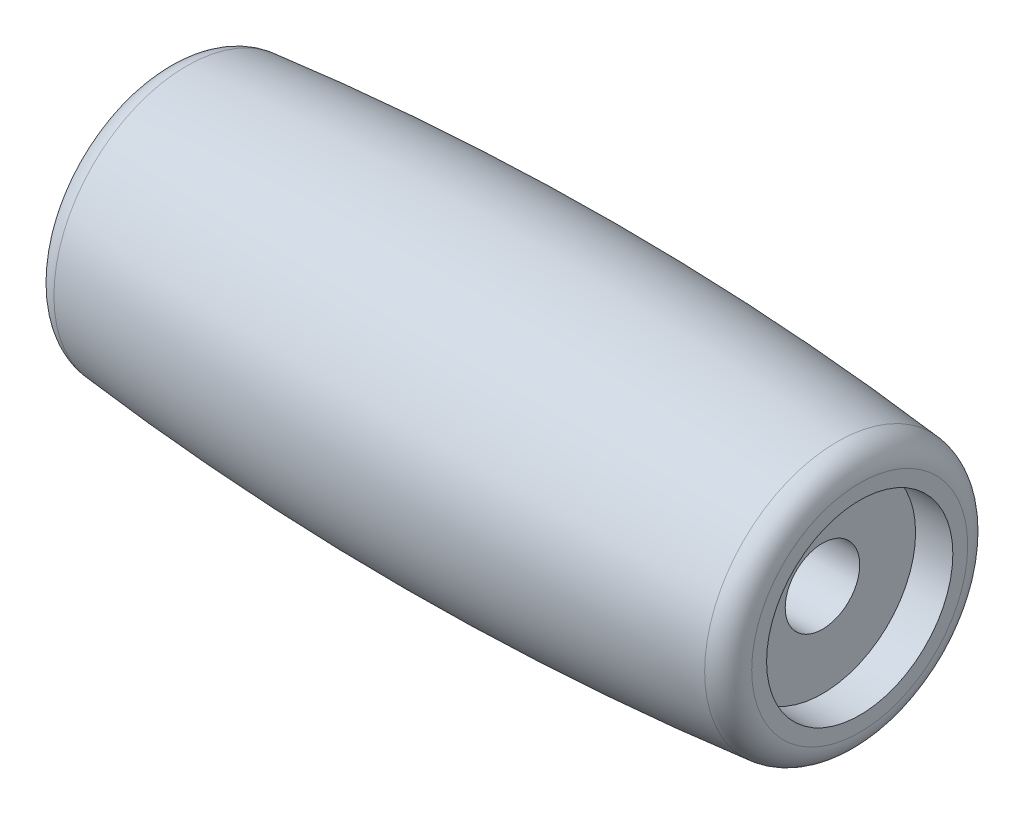
ISO-10303-21;
HEADER;
FILE_DESCRIPTION(('STEP AP214'),'2;1');
FILE_NAME('part.step','',(''),(''),'','','');
FILE_SCHEMA(('AUTOMOTIVE_DESIGN { 1 0 10303 214 1 1 1 1 }'));
ENDSEC;
DATA;
#1=APPLICATION_CONTEXT('core data for automotive mechanical design processes');
#2=APPLICATION_PROTOCOL_DEFINITION('international standard','automotive_design',2000,#1);
#3=PRODUCT_CONTEXT('',#1,'mechanical');
#4=PRODUCT('Part','Part','',(#3));
#5=PRODUCT_RELATED_PRODUCT_CATEGORY('part','',(#4));
#6=PRODUCT_DEFINITION_FORMATION('','',#4);
#7=PRODUCT_DEFINITION_CONTEXT('part definition',#1,'design');
#8=PRODUCT_DEFINITION('design','',#6,#7);
#9=PRODUCT_DEFINITION_SHAPE('','',#8);
#10=(LENGTH_UNIT() NAMED_UNIT(*) SI_UNIT(.MILLI.,.METRE.));
#11=(NAMED_UNIT(*) PLANE_ANGLE_UNIT() SI_UNIT($,.RADIAN.));
#12=(NAMED_UNIT(*) SI_UNIT($,.STERADIAN.) SOLID_ANGLE_UNIT());
#13=UNCERTAINTY_MEASURE_WITH_UNIT(LENGTH_MEASURE(1.E-05),#10,'distance_accuracy_value','');
#14=(GEOMETRIC_REPRESENTATION_CONTEXT(3) GLOBAL_UNCERTAINTY_ASSIGNED_CONTEXT((#13)) GLOBAL_UNIT_ASSIGNED_CONTEXT((#10,
#11,#12)) REPRESENTATION_CONTEXT('',''));
#15=CARTESIAN_POINT('',(0.,0.,0.));
#16=DIRECTION('',(0.,0.,1.));
#17=DIRECTION('',(1.,0.,0.));
#18=AXIS2_PLACEMENT_3D('',#15,#16,#17);
#19=CARTESIAN_POINT('',(0.,0.,0.));
#20=DIRECTION('',(-1.,0.,0.));
#21=DIRECTION('',(0.,0.,1.));
#22=AXIS2_PLACEMENT_3D('',#19,#20,#21);
#23=CYLINDRICAL_SURFACE('',#22,3.75);
#24=CARTESIAN_POINT('',(-12.5,0.,0.));
#25=DIRECTION('',(-1.,0.,0.));
#26=DIRECTION('',(0.,0.,1.));
#27=AXIS2_PLACEMENT_3D('',#24,#25,#26);
#28=CIRCLE('',#27,3.75);
#29=CARTESIAN_POINT('',(-12.5,0.,3.75));
#30=VERTEX_POINT('',#29);
#31=EDGE_CURVE('E64',#30,#30,#28,.T.);
#32=ORIENTED_EDGE('',*,*,#31,.F.);
#33=EDGE_LOOP('',(#32));
#34=FACE_BOUND('',#33,.T.);
#35=CARTESIAN_POINT('',(-14.,0.,0.));
#36=DIRECTION('',(-1.,0.,0.));
#37=DIRECTION('',(0.,0.,1.));
#38=AXIS2_PLACEMENT_3D('',#35,#36,#37);
#39=CIRCLE('',#38,3.75);
#40=CARTESIAN_POINT('',(-14.,0.,3.75));
#41=VERTEX_POINT('',#40);
#42=EDGE_CURVE('E10',#41,#41,#39,.T.);
#43=ORIENTED_EDGE('',*,*,#42,.T.);
#44=EDGE_LOOP('',(#43));
#45=FACE_BOUND('',#44,.T.);
#46=ADVANCED_FACE('F30',(#34,#45),#23,.F.);
#47=CARTESIAN_POINT('',(-14.,3.75,0.));
#48=DIRECTION('',(1.,0.,0.));
#49=DIRECTION('',(0.,0.,-1.));
#50=AXIS2_PLACEMENT_3D('',#47,#48,#49);
#51=PLANE('',#50);
#52=ORIENTED_EDGE('',*,*,#42,.F.);
#53=EDGE_LOOP('',(#52));
#54=FACE_BOUND('',#53,.T.);
#55=CARTESIAN_POINT('',(-14.,0.,0.));
#56=DIRECTION('',(-1.,0.,0.));
#57=DIRECTION('',(0.,0.,1.));
#58=AXIS2_PLACEMENT_3D('',#55,#56,#57);
#59=CIRCLE('',#58,4.34857666506388);
#60=CARTESIAN_POINT('',(-14.,0.,4.34857666506388));
#61=VERTEX_POINT('',#60);
#62=EDGE_CURVE('E36',#61,#61,#59,.T.);
#63=ORIENTED_EDGE('',*,*,#62,.T.);
#64=EDGE_LOOP('',(#63));
#65=FACE_BOUND('',#64,.T.);
#66=ADVANCED_FACE('F71',(#54,#65),#51,.F.);
#67=CARTESIAN_POINT('',(-13.,0.,0.));
#68=DIRECTION('',(-1.,0.,0.));
#69=DIRECTION('',(0.,0.,1.));
#70=AXIS2_PLACEMENT_3D('',#67,#68,#69);
#71=TOROIDAL_SURFACE('',#70,4.34857666506388,1.00000000000001);
#72=ORIENTED_EDGE('',*,*,#62,.F.);
#73=EDGE_LOOP('',(#72));
#74=FACE_BOUND('',#73,.T.);
#75=CARTESIAN_POINT('',(-13.0999679589875,0.,0.));
#76=DIRECTION('',(-1.,0.,0.));
#77=DIRECTION('',(0.,0.,1.));
#78=AXIS2_PLACEMENT_3D('',#75,#76,#77);
#79=CIRCLE('',#78,5.34356732189233);
#80=CARTESIAN_POINT('',(-13.0999679589875,0.,5.34356732189233));
#81=VERTEX_POINT('',#80);
#82=EDGE_CURVE('E40',#81,#81,#79,.T.);
#83=ORIENTED_EDGE('',*,*,#82,.T.);
#84=EDGE_LOOP('',(#83));
#85=FACE_BOUND('',#84,.T.);
#86=ADVANCED_FACE('F75',(#74,#85),#71,.T.);
#87=CARTESIAN_POINT('',(0.,0.,0.));
#88=DIRECTION('',(-1.,0.,0.));
#89=DIRECTION('',(0.,0.,1.));
#90=AXIS2_PLACEMENT_3D('',#87,#88,#89);
#91=DEGENERATE_TOROIDAL_SURFACE('',#90,125.041666666667,131.041666666667,.F.);
#92=ORIENTED_EDGE('',*,*,#82,.F.);
#93=EDGE_LOOP('',(#92));
#94=FACE_BOUND('',#93,.T.);
#95=CARTESIAN_POINT('',(13.0999679589875,0.,0.));
#96=DIRECTION('',(-1.,0.,0.));
#97=DIRECTION('',(0.,0.,1.));
#98=AXIS2_PLACEMENT_3D('',#95,#96,#97);
#99=CIRCLE('',#98,5.34356732189234);
#100=CARTESIAN_POINT('',(13.0999679589875,0.,5.34356732189234));
#101=VERTEX_POINT('',#100);
#102=EDGE_CURVE('E44',#101,#101,#99,.T.);
#103=ORIENTED_EDGE('',*,*,#102,.T.);
#104=EDGE_LOOP('',(#103));
#105=FACE_BOUND('',#104,.T.);
#106=ADVANCED_FACE('F80',(#94,#105),#91,.F.);
#107=CARTESIAN_POINT('',(13.,0.,0.));
#108=DIRECTION('',(-1.,0.,0.));
#109=DIRECTION('',(0.,0.,1.));
#110=AXIS2_PLACEMENT_3D('',#107,#108,#109);
#111=TOROIDAL_SURFACE('',#110,4.34857666506388,1.00000000000001);
#112=ORIENTED_EDGE('',*,*,#102,.F.);
#113=EDGE_LOOP('',(#112));
#114=FACE_BOUND('',#113,.T.);
#115=CARTESIAN_POINT('',(14.,0.,0.));
#116=DIRECTION('',(-1.,0.,0.));
#117=DIRECTION('',(0.,0.,1.));
#118=AXIS2_PLACEMENT_3D('',#115,#116,#117);
#119=CIRCLE('',#118,4.34857666506388);
#120=CARTESIAN_POINT('',(14.,0.,4.34857666506388));
#121=VERTEX_POINT('',#120);
#122=EDGE_CURVE('E49',#121,#121,#119,.T.);
#123=ORIENTED_EDGE('',*,*,#122,.T.);
#124=EDGE_LOOP('',(#123));
#125=FACE_BOUND('',#124,.T.);
#126=ADVANCED_FACE('F86',(#114,#125),#111,.T.);
#127=CARTESIAN_POINT('',(14.,3.75,0.));
#128=DIRECTION('',(-1.,0.,0.));
#129=DIRECTION('',(0.,0.,1.));
#130=AXIS2_PLACEMENT_3D('',#127,#128,#129);
#131=PLANE('',#130);
#132=ORIENTED_EDGE('',*,*,#122,.F.);
#133=EDGE_LOOP('',(#132));
#134=FACE_BOUND('',#133,.T.);
#135=CARTESIAN_POINT('',(14.,0.,0.));
#136=DIRECTION('',(-1.,0.,0.));
#137=DIRECTION('',(0.,0.,1.));
#138=AXIS2_PLACEMENT_3D('',#135,#136,#137);
#139=CIRCLE('',#138,3.75);
#140=CARTESIAN_POINT('',(14.,0.,3.75));
#141=VERTEX_POINT('',#140);
#142=EDGE_CURVE('E52',#141,#141,#139,.T.);
#143=ORIENTED_EDGE('',*,*,#142,.T.);
#144=EDGE_LOOP('',(#143));
#145=FACE_BOUND('',#144,.T.);
#146=ADVANCED_FACE('F90',(#134,#145),#131,.F.);
#147=CARTESIAN_POINT('',(0.,0.,0.));
#148=DIRECTION('',(-1.,0.,0.));
#149=DIRECTION('',(0.,0.,1.));
#150=AXIS2_PLACEMENT_3D('',#147,#148,#149);
#151=CYLINDRICAL_SURFACE('',#150,3.75);
#152=ORIENTED_EDGE('',*,*,#142,.F.);
#153=EDGE_LOOP('',(#152));
#154=FACE_BOUND('',#153,.T.);
#155=CARTESIAN_POINT('',(12.5,0.,0.));
#156=DIRECTION('',(-1.,0.,0.));
#157=DIRECTION('',(0.,0.,1.));
#158=AXIS2_PLACEMENT_3D('',#155,#156,#157);
#159=CIRCLE('',#158,3.75);
#160=CARTESIAN_POINT('',(12.5,0.,3.75));
#161=VERTEX_POINT('',#160);
#162=EDGE_CURVE('E55',#161,#161,#159,.T.);
#163=ORIENTED_EDGE('',*,*,#162,.T.);
#164=EDGE_LOOP('',(#163));
#165=FACE_BOUND('',#164,.T.);
#166=ADVANCED_FACE('F94',(#154,#165),#151,.F.);
#167=CARTESIAN_POINT('',(12.5,1.5,0.));
#168=DIRECTION('',(-1.,0.,0.));
#169=DIRECTION('',(0.,0.,1.));
#170=AXIS2_PLACEMENT_3D('',#167,#168,#169);
#171=PLANE('',#170);
#172=ORIENTED_EDGE('',*,*,#162,.F.);
#173=EDGE_LOOP('',(#172));
#174=FACE_BOUND('',#173,.T.);
#175=CARTESIAN_POINT('',(12.5,0.,0.));
#176=DIRECTION('',(-1.,0.,0.));
#177=DIRECTION('',(0.,0.,1.));
#178=AXIS2_PLACEMENT_3D('',#175,#176,#177);
#179=CIRCLE('',#178,1.5);
#180=CARTESIAN_POINT('',(12.5,0.,1.5));
#181=VERTEX_POINT('',#180);
#182=EDGE_CURVE('E58',#181,#181,#179,.T.);
#183=ORIENTED_EDGE('',*,*,#182,.T.);
#184=EDGE_LOOP('',(#183));
#185=FACE_BOUND('',#184,.T.);
#186=ADVANCED_FACE('F98',(#174,#185),#171,.F.);
#187=CARTESIAN_POINT('',(0.,0.,0.));
#188=DIRECTION('',(-1.,0.,0.));
#189=DIRECTION('',(0.,0.,1.));
#190=AXIS2_PLACEMENT_3D('',#187,#188,#189);
#191=CYLINDRICAL_SURFACE('',#190,1.5);
#192=ORIENTED_EDGE('',*,*,#182,.F.);
#193=EDGE_LOOP('',(#192));
#194=FACE_BOUND('',#193,.T.);
#195=CARTESIAN_POINT('',(-12.5,0.,0.));
#196=DIRECTION('',(-1.,0.,0.));
#197=DIRECTION('',(0.,0.,1.));
#198=AXIS2_PLACEMENT_3D('',#195,#196,#197);
#199=CIRCLE('',#198,1.5);
#200=CARTESIAN_POINT('',(-12.5,0.,1.5));
#201=VERTEX_POINT('',#200);
#202=EDGE_CURVE('E61',#201,#201,#199,.T.);
#203=ORIENTED_EDGE('',*,*,#202,.T.);
#204=EDGE_LOOP('',(#203));
#205=FACE_BOUND('',#204,.T.);
#206=ADVANCED_FACE('F102',(#194,#205),#191,.F.);
#207=CARTESIAN_POINT('',(-12.5,1.5,0.));
#208=DIRECTION('',(1.,0.,0.));
#209=DIRECTION('',(0.,0.,-1.));
#210=AXIS2_PLACEMENT_3D('',#207,#208,#209);
#211=PLANE('',#210);
#212=ORIENTED_EDGE('',*,*,#202,.F.);
#213=EDGE_LOOP('',(#212));
#214=FACE_BOUND('',#213,.T.);
#215=ORIENTED_EDGE('',*,*,#31,.T.);
#216=EDGE_LOOP('',(#215));
#217=FACE_BOUND('',#216,.T.);
#218=ADVANCED_FACE('F68',(#214,#217),#211,.F.);
#219=CLOSED_SHELL('',(#46,#66,#86,#106,#126,#146,#166,#186,#206,#218));
#220=MANIFOLD_SOLID_BREP('B2',#219);
#221=ADVANCED_BREP_SHAPE_REPRESENTATION('',(#18,#220),#14);
#222=SHAPE_DEFINITION_REPRESENTATION(#9,#221);
ENDSEC;
END-ISO-10303-21;
